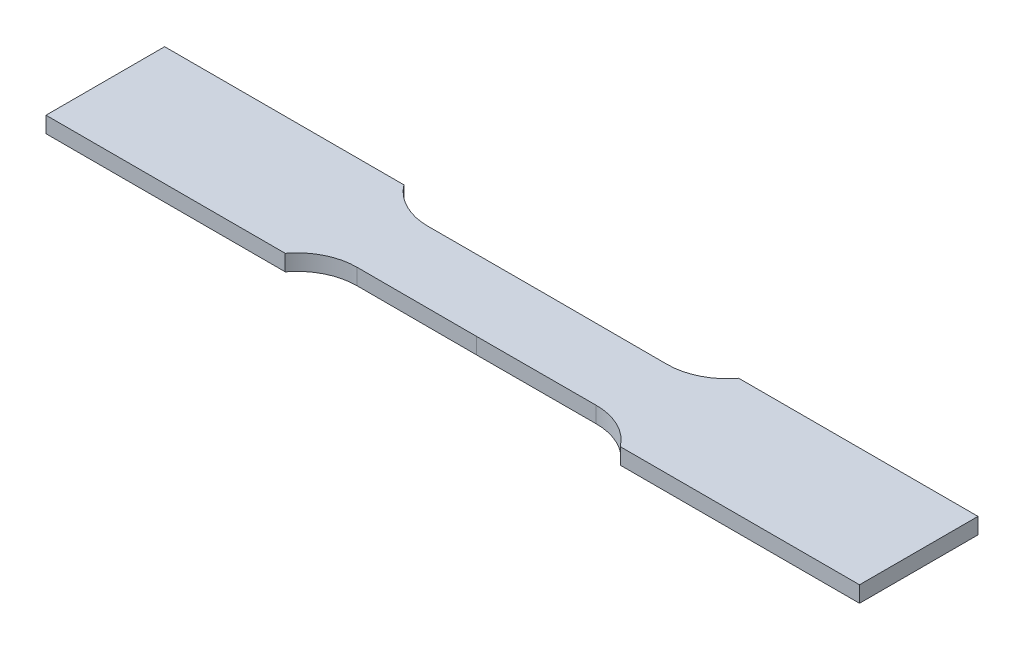
ISO-10303-21;
HEADER;
FILE_DESCRIPTION(('STEP AP214'),'2;1');
FILE_NAME('part.step','',(''),(''),'','','');
FILE_SCHEMA(('AUTOMOTIVE_DESIGN { 1 0 10303 214 1 1 1 1 }'));
ENDSEC;
DATA;
#1=APPLICATION_CONTEXT('core data for automotive mechanical design processes');
#2=APPLICATION_PROTOCOL_DEFINITION('international standard','automotive_design',2000,#1);
#3=PRODUCT_CONTEXT('',#1,'mechanical');
#4=PRODUCT('Part','Part','',(#3));
#5=PRODUCT_RELATED_PRODUCT_CATEGORY('part','',(#4));
#6=PRODUCT_DEFINITION_FORMATION('','',#4);
#7=PRODUCT_DEFINITION_CONTEXT('part definition',#1,'design');
#8=PRODUCT_DEFINITION('design','',#6,#7);
#9=PRODUCT_DEFINITION_SHAPE('','',#8);
#10=(LENGTH_UNIT() NAMED_UNIT(*) SI_UNIT(.MILLI.,.METRE.));
#11=(NAMED_UNIT(*) PLANE_ANGLE_UNIT() SI_UNIT($,.RADIAN.));
#12=(NAMED_UNIT(*) SI_UNIT($,.STERADIAN.) SOLID_ANGLE_UNIT());
#13=UNCERTAINTY_MEASURE_WITH_UNIT(LENGTH_MEASURE(1.E-05),#10,'distance_accuracy_value','');
#14=(GEOMETRIC_REPRESENTATION_CONTEXT(3) GLOBAL_UNCERTAINTY_ASSIGNED_CONTEXT((#13)) GLOBAL_UNIT_ASSIGNED_CONTEXT((#10,
#11,#12)) REPRESENTATION_CONTEXT('',''));
#15=CARTESIAN_POINT('',(0.,0.,0.));
#16=DIRECTION('',(0.,0.,1.));
#17=DIRECTION('',(1.,0.,0.));
#18=AXIS2_PLACEMENT_3D('',#15,#16,#17);
#19=CARTESIAN_POINT('',(0.,3.357,-12.381710976723));
#20=DIRECTION('',(0.,0.,-1.));
#21=DIRECTION('',(-1.,0.,0.));
#22=AXIS2_PLACEMENT_3D('',#19,#20,#21);
#23=PLANE('',#22);
#24=DIRECTION('',(1.,0.,0.));
#25=VECTOR('',#24,1.);
#26=CARTESIAN_POINT('',(0.,0.,-12.381710976723));
#27=LINE('',#26,#25);
#28=CARTESIAN_POINT('',(35.,0.,-12.3817109767229));
#29=VERTEX_POINT('',#28);
#30=CARTESIAN_POINT('',(85.,0.,-12.3817109767229));
#31=VERTEX_POINT('',#30);
#32=EDGE_CURVE('E168',#29,#31,#27,.T.);
#33=ORIENTED_EDGE('',*,*,#32,.F.);
#34=DIRECTION('',(0.,-1.,0.));
#35=VECTOR('',#34,1.);
#36=CARTESIAN_POINT('',(35.,3.357,-12.3817109767229));
#37=LINE('',#36,#35);
#38=CARTESIAN_POINT('',(35.,3.357,-12.3817109767229));
#39=VERTEX_POINT('',#38);
#40=EDGE_CURVE('E11',#39,#29,#37,.T.);
#41=ORIENTED_EDGE('',*,*,#40,.F.);
#42=DIRECTION('',(1.,0.,0.));
#43=VECTOR('',#42,1.);
#44=CARTESIAN_POINT('',(0.,3.357,-12.381710976723));
#45=LINE('',#44,#43);
#46=CARTESIAN_POINT('',(85.,3.357,-12.3817109767229));
#47=VERTEX_POINT('',#46);
#48=EDGE_CURVE('E201',#39,#47,#45,.T.);
#49=ORIENTED_EDGE('',*,*,#48,.T.);
#50=DIRECTION('',(0.,-1.,0.));
#51=VECTOR('',#50,1.);
#52=CARTESIAN_POINT('',(85.,3.357,-12.3817109767229));
#53=LINE('',#52,#51);
#54=EDGE_CURVE('E53',#47,#31,#53,.T.);
#55=ORIENTED_EDGE('',*,*,#54,.T.);
#56=EDGE_LOOP('',(#33,#41,#49,#55));
#57=FACE_BOUND('',#56,.T.);
#58=ADVANCED_FACE('F37',(#57),#23,.T.);
#59=CARTESIAN_POINT('',(25.01749998285,3.357,-19.904987750018));
#60=DIRECTION('',(0.,-1.,0.));
#61=DIRECTION('',(0.,0.,-1.));
#62=AXIS2_PLACEMENT_3D('',#59,#60,#61);
#63=CYLINDRICAL_SURFACE('',#62,12.5);
#64=CARTESIAN_POINT('',(25.01749998285,0.,-19.904987750018));
#65=DIRECTION('',(0.,1.,0.));
#66=DIRECTION('',(0.,0.,1.));
#67=AXIS2_PLACEMENT_3D('',#64,#65,#66);
#68=CIRCLE('',#67,12.5);
#69=CARTESIAN_POINT('',(25.,0.,-7.40500000000001));
#70=VERTEX_POINT('',#69);
#71=EDGE_CURVE('E170',#29,#70,#68,.F.);
#72=ORIENTED_EDGE('',*,*,#71,.T.);
#73=DIRECTION('',(0.,-1.,0.));
#74=VECTOR('',#73,1.);
#75=CARTESIAN_POINT('',(25.,3.357,-7.40500000000001));
#76=LINE('',#75,#74);
#77=CARTESIAN_POINT('',(25.,3.357,-7.40500000000001));
#78=VERTEX_POINT('',#77);
#79=EDGE_CURVE('E45',#78,#70,#76,.T.);
#80=ORIENTED_EDGE('',*,*,#79,.F.);
#81=CARTESIAN_POINT('',(25.01749998285,3.357,-19.904987750018));
#82=DIRECTION('',(0.,1.,0.));
#83=DIRECTION('',(0.,0.,1.));
#84=AXIS2_PLACEMENT_3D('',#81,#82,#83);
#85=CIRCLE('',#84,12.5);
#86=EDGE_CURVE('E250',#39,#78,#85,.F.);
#87=ORIENTED_EDGE('',*,*,#86,.F.);
#88=ORIENTED_EDGE('',*,*,#40,.T.);
#89=EDGE_LOOP('',(#72,#80,#87,#88));
#90=FACE_BOUND('',#89,.T.);
#91=ADVANCED_FACE('F283',(#90),#63,.F.);
#92=CARTESIAN_POINT('',(0.0104159795846786,3.357,-7.43998541762858));
#93=DIRECTION('',(-0.00139999862800182,0.,0.999999020001441));
#94=DIRECTION('',(0.999999020001441,0.,0.00139999862800182));
#95=AXIS2_PLACEMENT_3D('',#92,#93,#94);
#96=PLANE('',#95);
#97=DIRECTION('',(-0.999999020001441,0.,-0.00139999862800182));
#98=VECTOR('',#97,1.);
#99=CARTESIAN_POINT('',(0.0104159795846786,0.,-7.43998541762858));
#100=LINE('',#99,#98);
#101=CARTESIAN_POINT('',(0.,0.,-7.44));
#102=VERTEX_POINT('',#101);
#103=EDGE_CURVE('E172',#70,#102,#100,.T.);
#104=ORIENTED_EDGE('',*,*,#103,.T.);
#105=DIRECTION('',(0.,-1.,0.));
#106=VECTOR('',#105,1.);
#107=CARTESIAN_POINT('',(0.,3.357,-7.44));
#108=LINE('',#107,#106);
#109=CARTESIAN_POINT('',(0.,3.357,-7.44));
#110=VERTEX_POINT('',#109);
#111=EDGE_CURVE('E222',#110,#102,#108,.T.);
#112=ORIENTED_EDGE('',*,*,#111,.F.);
#113=DIRECTION('',(-0.999999020001441,0.,-0.00139999862800182));
#114=VECTOR('',#113,1.);
#115=CARTESIAN_POINT('',(0.0104159795846786,3.357,-7.43998541762858));
#116=LINE('',#115,#114);
#117=EDGE_CURVE('E231',#78,#110,#116,.T.);
#118=ORIENTED_EDGE('',*,*,#117,.F.);
#119=ORIENTED_EDGE('',*,*,#79,.T.);
#120=EDGE_LOOP('',(#104,#112,#118,#119));
#121=FACE_BOUND('',#120,.T.);
#122=ADVANCED_FACE('F229',(#121),#96,.F.);
#123=CARTESIAN_POINT('',(-0.00743999256000765,3.357,-7.43999256000744));
#124=DIRECTION('',(0.000999999500000403,0.,0.999999500000375));
#125=DIRECTION('',(0.999999500000375,0.,-0.000999999500000403));
#126=AXIS2_PLACEMENT_3D('',#123,#124,#125);
#127=PLANE('',#126);
#128=DIRECTION('',(-0.999999500000375,0.,0.000999999500000403));
#129=VECTOR('',#128,1.);
#130=CARTESIAN_POINT('',(-0.00743999256000765,0.,-7.43999256000744));
#131=LINE('',#130,#129);
#132=CARTESIAN_POINT('',(-25.,0.,-7.415));
#133=VERTEX_POINT('',#132);
#134=EDGE_CURVE('E174',#102,#133,#131,.T.);
#135=ORIENTED_EDGE('',*,*,#134,.T.);
#136=DIRECTION('',(0.,-1.,0.));
#137=VECTOR('',#136,1.);
#138=CARTESIAN_POINT('',(-25.,3.357,-7.415));
#139=LINE('',#138,#137);
#140=CARTESIAN_POINT('',(-25.,3.357,-7.415));
#141=VERTEX_POINT('',#140);
#142=EDGE_CURVE('E220',#141,#133,#139,.T.);
#143=ORIENTED_EDGE('',*,*,#142,.F.);
#144=DIRECTION('',(-0.999999500000375,0.,0.000999999500000403));
#145=VECTOR('',#144,1.);
#146=CARTESIAN_POINT('',(-0.00743999256000765,3.357,-7.43999256000744));
#147=LINE('',#146,#145);
#148=EDGE_CURVE('E244',#110,#141,#147,.T.);
#149=ORIENTED_EDGE('',*,*,#148,.F.);
#150=ORIENTED_EDGE('',*,*,#111,.T.);
#151=EDGE_LOOP('',(#135,#143,#149,#150));
#152=FACE_BOUND('',#151,.T.);
#153=ADVANCED_FACE('F241',(#152),#127,.F.);
#154=CARTESIAN_POINT('',(-25.01249999375,3.357,-19.9149937500047));
#155=DIRECTION('',(0.,-1.,0.));
#156=DIRECTION('',(0.,0.,-1.));
#157=AXIS2_PLACEMENT_3D('',#154,#155,#156);
#158=CYLINDRICAL_SURFACE('',#157,12.5);
#159=CARTESIAN_POINT('',(-25.01249999375,0.,-19.9149937500047));
#160=DIRECTION('',(0.,1.,0.));
#161=DIRECTION('',(0.,0.,1.));
#162=AXIS2_PLACEMENT_3D('',#159,#160,#161);
#163=CIRCLE('',#162,12.5);
#164=CARTESIAN_POINT('',(-35.,0.,-12.3983559627253));
#165=VERTEX_POINT('',#164);
#166=EDGE_CURVE('E177',#165,#133,#163,.T.);
#167=ORIENTED_EDGE('',*,*,#166,.F.);
#168=DIRECTION('',(0.,-1.,0.));
#169=VECTOR('',#168,1.);
#170=CARTESIAN_POINT('',(-35.,3.357,-12.3983559627253));
#171=LINE('',#170,#169);
#172=CARTESIAN_POINT('',(-35.,3.357,-12.3983559627253));
#173=VERTEX_POINT('',#172);
#174=EDGE_CURVE('E218',#173,#165,#171,.T.);
#175=ORIENTED_EDGE('',*,*,#174,.F.);
#176=CARTESIAN_POINT('',(-25.01249999375,3.357,-19.9149937500047));
#177=DIRECTION('',(0.,1.,0.));
#178=DIRECTION('',(0.,0.,1.));
#179=AXIS2_PLACEMENT_3D('',#176,#177,#178);
#180=CIRCLE('',#179,12.5);
#181=EDGE_CURVE('E246',#173,#141,#180,.T.);
#182=ORIENTED_EDGE('',*,*,#181,.T.);
#183=ORIENTED_EDGE('',*,*,#142,.T.);
#184=EDGE_LOOP('',(#167,#175,#182,#183));
#185=FACE_BOUND('',#184,.T.);
#186=ADVANCED_FACE('F294',(#185),#158,.F.);
#187=CARTESIAN_POINT('',(0.,3.357,-12.3983559627253));
#188=DIRECTION('',(0.,0.,1.));
#189=DIRECTION('',(1.,0.,0.));
#190=AXIS2_PLACEMENT_3D('',#187,#188,#189);
#191=PLANE('',#190);
#192=DIRECTION('',(-1.,0.,0.));
#193=VECTOR('',#192,1.);
#194=CARTESIAN_POINT('',(0.,0.,-12.3983559627253));
#195=LINE('',#194,#193);
#196=CARTESIAN_POINT('',(-85.,0.,-12.3983559627253));
#197=VERTEX_POINT('',#196);
#198=EDGE_CURVE('E180',#165,#197,#195,.T.);
#199=ORIENTED_EDGE('',*,*,#198,.T.);
#200=DIRECTION('',(0.,-1.,0.));
#201=VECTOR('',#200,1.);
#202=CARTESIAN_POINT('',(-85.,3.357,-12.3983559627253));
#203=LINE('',#202,#201);
#204=CARTESIAN_POINT('',(-85.,3.357,-12.3983559627253));
#205=VERTEX_POINT('',#204);
#206=EDGE_CURVE('E215',#205,#197,#203,.T.);
#207=ORIENTED_EDGE('',*,*,#206,.F.);
#208=DIRECTION('',(-1.,0.,0.));
#209=VECTOR('',#208,1.);
#210=CARTESIAN_POINT('',(0.,3.357,-12.3983559627253));
#211=LINE('',#210,#209);
#212=EDGE_CURVE('E248',#173,#205,#211,.T.);
#213=ORIENTED_EDGE('',*,*,#212,.F.);
#214=ORIENTED_EDGE('',*,*,#174,.T.);
#215=EDGE_LOOP('',(#199,#207,#213,#214));
#216=FACE_BOUND('',#215,.T.);
#217=ADVANCED_FACE('F297',(#216),#191,.F.);
#218=CARTESIAN_POINT('',(-85.,3.357,0.));
#219=DIRECTION('',(1.,0.,0.));
#220=DIRECTION('',(0.,0.,-1.));
#221=AXIS2_PLACEMENT_3D('',#218,#219,#220);
#222=PLANE('',#221);
#223=DIRECTION('',(0.,0.,1.));
#224=VECTOR('',#223,1.);
#225=CARTESIAN_POINT('',(-85.,0.,0.));
#226=LINE('',#225,#224);
#227=CARTESIAN_POINT('',(-85.,0.,12.3983559627253));
#228=VERTEX_POINT('',#227);
#229=EDGE_CURVE('E182',#197,#228,#226,.T.);
#230=ORIENTED_EDGE('',*,*,#229,.T.);
#231=DIRECTION('',(0.,-1.,0.));
#232=VECTOR('',#231,1.);
#233=CARTESIAN_POINT('',(-85.,3.357,12.3983559627253));
#234=LINE('',#233,#232);
#235=CARTESIAN_POINT('',(-85.,3.357,12.3983559627253));
#236=VERTEX_POINT('',#235);
#237=EDGE_CURVE('E213',#236,#228,#234,.T.);
#238=ORIENTED_EDGE('',*,*,#237,.F.);
#239=DIRECTION('',(0.,0.,1.));
#240=VECTOR('',#239,1.);
#241=CARTESIAN_POINT('',(-85.,3.357,0.));
#242=LINE('',#241,#240);
#243=EDGE_CURVE('E255',#205,#236,#242,.T.);
#244=ORIENTED_EDGE('',*,*,#243,.F.);
#245=ORIENTED_EDGE('',*,*,#206,.T.);
#246=EDGE_LOOP('',(#230,#238,#244,#245));
#247=FACE_BOUND('',#246,.T.);
#248=ADVANCED_FACE('F301',(#247),#222,.F.);
#249=CARTESIAN_POINT('',(0.,3.357,12.3983559627253));
#250=DIRECTION('',(0.,0.,1.));
#251=DIRECTION('',(1.,0.,0.));
#252=AXIS2_PLACEMENT_3D('',#249,#250,#251);
#253=PLANE('',#252);
#254=DIRECTION('',(-1.,0.,0.));
#255=VECTOR('',#254,1.);
#256=CARTESIAN_POINT('',(0.,0.,12.3983559627253));
#257=LINE('',#256,#255);
#258=CARTESIAN_POINT('',(-35.,0.,12.3983559627253));
#259=VERTEX_POINT('',#258);
#260=EDGE_CURVE('E185',#259,#228,#257,.T.);
#261=ORIENTED_EDGE('',*,*,#260,.F.);
#262=DIRECTION('',(0.,-1.,0.));
#263=VECTOR('',#262,1.);
#264=CARTESIAN_POINT('',(-35.,3.357,12.3983559627253));
#265=LINE('',#264,#263);
#266=CARTESIAN_POINT('',(-35.,3.357,12.3983559627253));
#267=VERTEX_POINT('',#266);
#268=EDGE_CURVE('E211',#267,#259,#265,.T.);
#269=ORIENTED_EDGE('',*,*,#268,.F.);
#270=DIRECTION('',(-1.,0.,0.));
#271=VECTOR('',#270,1.);
#272=CARTESIAN_POINT('',(0.,3.357,12.3983559627253));
#273=LINE('',#272,#271);
#274=EDGE_CURVE('E257',#267,#236,#273,.T.);
#275=ORIENTED_EDGE('',*,*,#274,.T.);
#276=ORIENTED_EDGE('',*,*,#237,.T.);
#277=EDGE_LOOP('',(#261,#269,#275,#276));
#278=FACE_BOUND('',#277,.T.);
#279=ADVANCED_FACE('F305',(#278),#253,.T.);
#280=CARTESIAN_POINT('',(-25.01249999375,3.357,19.9149937500047));
#281=DIRECTION('',(0.,-1.,0.));
#282=DIRECTION('',(0.,0.,-1.));
#283=AXIS2_PLACEMENT_3D('',#280,#281,#282);
#284=CYLINDRICAL_SURFACE('',#283,12.5);
#285=CARTESIAN_POINT('',(-25.01249999375,0.,19.9149937500047));
#286=DIRECTION('',(0.,1.,0.));
#287=DIRECTION('',(0.,0.,1.));
#288=AXIS2_PLACEMENT_3D('',#285,#286,#287);
#289=CIRCLE('',#288,12.5);
#290=CARTESIAN_POINT('',(-25.,0.,7.415));
#291=VERTEX_POINT('',#290);
#292=EDGE_CURVE('E188',#259,#291,#289,.F.);
#293=ORIENTED_EDGE('',*,*,#292,.T.);
#294=DIRECTION('',(0.,-1.,0.));
#295=VECTOR('',#294,1.);
#296=CARTESIAN_POINT('',(-25.,3.357,7.415));
#297=LINE('',#296,#295);
#298=CARTESIAN_POINT('',(-25.,3.357,7.415));
#299=VERTEX_POINT('',#298);
#300=EDGE_CURVE('E208',#299,#291,#297,.T.);
#301=ORIENTED_EDGE('',*,*,#300,.F.);
#302=CARTESIAN_POINT('',(-25.01249999375,3.357,19.9149937500047));
#303=DIRECTION('',(0.,1.,0.));
#304=DIRECTION('',(0.,0.,1.));
#305=AXIS2_PLACEMENT_3D('',#302,#303,#304);
#306=CIRCLE('',#305,12.5);
#307=EDGE_CURVE('E260',#267,#299,#306,.F.);
#308=ORIENTED_EDGE('',*,*,#307,.F.);
#309=ORIENTED_EDGE('',*,*,#268,.T.);
#310=EDGE_LOOP('',(#293,#301,#308,#309));
#311=FACE_BOUND('',#310,.T.);
#312=ADVANCED_FACE('F309',(#311),#284,.F.);
#313=CARTESIAN_POINT('',(-0.00743999256000765,3.357,7.43999256000744));
#314=DIRECTION('',(0.000999999500000403,0.,-0.999999500000375));
#315=DIRECTION('',(-0.999999500000375,0.,-0.000999999500000403));
#316=AXIS2_PLACEMENT_3D('',#313,#314,#315);
#317=PLANE('',#316);
#318=DIRECTION('',(0.999999500000375,0.,0.000999999500000403));
#319=VECTOR('',#318,1.);
#320=CARTESIAN_POINT('',(-0.00743999256000765,0.,7.43999256000744));
#321=LINE('',#320,#319);
#322=CARTESIAN_POINT('',(0.,0.,7.44));
#323=VERTEX_POINT('',#322);
#324=EDGE_CURVE('E190',#291,#323,#321,.T.);
#325=ORIENTED_EDGE('',*,*,#324,.T.);
#326=DIRECTION('',(0.,-1.,0.));
#327=VECTOR('',#326,1.);
#328=CARTESIAN_POINT('',(0.,3.357,7.44));
#329=LINE('',#328,#327);
#330=CARTESIAN_POINT('',(0.,3.357,7.44));
#331=VERTEX_POINT('',#330);
#332=EDGE_CURVE('E205',#331,#323,#329,.T.);
#333=ORIENTED_EDGE('',*,*,#332,.F.);
#334=DIRECTION('',(0.999999500000375,0.,0.000999999500000403));
#335=VECTOR('',#334,1.);
#336=CARTESIAN_POINT('',(-0.00743999256000765,3.357,7.43999256000744));
#337=LINE('',#336,#335);
#338=EDGE_CURVE('E163',#299,#331,#337,.T.);
#339=ORIENTED_EDGE('',*,*,#338,.F.);
#340=ORIENTED_EDGE('',*,*,#300,.T.);
#341=EDGE_LOOP('',(#325,#333,#339,#340));
#342=FACE_BOUND('',#341,.T.);
#343=ADVANCED_FACE('F267',(#342),#317,.F.);
#344=CARTESIAN_POINT('',(0.0104159795846817,3.357,7.43998541762858));
#345=DIRECTION('',(-0.00139999862800224,0.,-0.999999020001441));
#346=DIRECTION('',(-0.999999020001441,0.,0.00139999862800224));
#347=AXIS2_PLACEMENT_3D('',#344,#345,#346);
#348=PLANE('',#347);
#349=DIRECTION('',(0.999999020001441,0.,-0.00139999862800224));
#350=VECTOR('',#349,1.);
#351=CARTESIAN_POINT('',(0.0104159795846817,0.,7.43998541762858));
#352=LINE('',#351,#350);
#353=CARTESIAN_POINT('',(25.,0.,7.405));
#354=VERTEX_POINT('',#353);
#355=EDGE_CURVE('E192',#323,#354,#352,.T.);
#356=ORIENTED_EDGE('',*,*,#355,.T.);
#357=DIRECTION('',(0.,-1.,0.));
#358=VECTOR('',#357,1.);
#359=CARTESIAN_POINT('',(25.,3.357,7.405));
#360=LINE('',#359,#358);
#361=CARTESIAN_POINT('',(25.,3.357,7.405));
#362=VERTEX_POINT('',#361);
#363=EDGE_CURVE('E149',#362,#354,#360,.T.);
#364=ORIENTED_EDGE('',*,*,#363,.F.);
#365=DIRECTION('',(0.999999020001441,0.,-0.00139999862800224));
#366=VECTOR('',#365,1.);
#367=CARTESIAN_POINT('',(0.0104159795846817,3.357,7.43998541762858));
#368=LINE('',#367,#366);
#369=EDGE_CURVE('E160',#331,#362,#368,.T.);
#370=ORIENTED_EDGE('',*,*,#369,.F.);
#371=ORIENTED_EDGE('',*,*,#332,.T.);
#372=EDGE_LOOP('',(#356,#364,#370,#371));
#373=FACE_BOUND('',#372,.T.);
#374=ADVANCED_FACE('F271',(#373),#348,.F.);
#375=CARTESIAN_POINT('',(25.01749998285,3.357,19.904987750018));
#376=DIRECTION('',(0.,-1.,0.));
#377=DIRECTION('',(0.,0.,-1.));
#378=AXIS2_PLACEMENT_3D('',#375,#376,#377);
#379=CYLINDRICAL_SURFACE('',#378,12.5);
#380=CARTESIAN_POINT('',(25.01749998285,0.,19.904987750018));
#381=DIRECTION('',(0.,1.,0.));
#382=DIRECTION('',(0.,0.,1.));
#383=AXIS2_PLACEMENT_3D('',#380,#381,#382);
#384=CIRCLE('',#383,12.5);
#385=CARTESIAN_POINT('',(35.,0.,12.3817109767229));
#386=VERTEX_POINT('',#385);
#387=EDGE_CURVE('E146',#386,#354,#384,.T.);
#388=ORIENTED_EDGE('',*,*,#387,.F.);
#389=DIRECTION('',(0.,-1.,0.));
#390=VECTOR('',#389,1.);
#391=CARTESIAN_POINT('',(35.,3.357,12.3817109767229));
#392=LINE('',#391,#390);
#393=CARTESIAN_POINT('',(35.,3.357,12.3817109767229));
#394=VERTEX_POINT('',#393);
#395=EDGE_CURVE('E140',#394,#386,#392,.T.);
#396=ORIENTED_EDGE('',*,*,#395,.F.);
#397=CARTESIAN_POINT('',(25.01749998285,3.357,19.904987750018));
#398=DIRECTION('',(0.,1.,0.));
#399=DIRECTION('',(0.,0.,1.));
#400=AXIS2_PLACEMENT_3D('',#397,#398,#399);
#401=CIRCLE('',#400,12.5);
#402=EDGE_CURVE('E144',#394,#362,#401,.T.);
#403=ORIENTED_EDGE('',*,*,#402,.T.);
#404=ORIENTED_EDGE('',*,*,#363,.T.);
#405=EDGE_LOOP('',(#388,#396,#403,#404));
#406=FACE_BOUND('',#405,.T.);
#407=ADVANCED_FACE('F142',(#406),#379,.F.);
#408=CARTESIAN_POINT('',(0.,3.357,12.381710976723));
#409=DIRECTION('',(0.,0.,-1.));
#410=DIRECTION('',(-1.,0.,0.));
#411=AXIS2_PLACEMENT_3D('',#408,#409,#410);
#412=PLANE('',#411);
#413=DIRECTION('',(1.,0.,0.));
#414=VECTOR('',#413,1.);
#415=CARTESIAN_POINT('',(0.,0.,12.381710976723));
#416=LINE('',#415,#414);
#417=CARTESIAN_POINT('',(85.,0.,12.3817109767229));
#418=VERTEX_POINT('',#417);
#419=EDGE_CURVE('E196',#386,#418,#416,.T.);
#420=ORIENTED_EDGE('',*,*,#419,.T.);
#421=DIRECTION('',(0.,-1.,0.));
#422=VECTOR('',#421,1.);
#423=CARTESIAN_POINT('',(85.,3.357,12.3817109767229));
#424=LINE('',#423,#422);
#425=CARTESIAN_POINT('',(85.,3.357,12.3817109767229));
#426=VERTEX_POINT('',#425);
#427=EDGE_CURVE('E97',#426,#418,#424,.T.);
#428=ORIENTED_EDGE('',*,*,#427,.F.);
#429=DIRECTION('',(1.,0.,0.));
#430=VECTOR('',#429,1.);
#431=CARTESIAN_POINT('',(0.,3.357,12.381710976723));
#432=LINE('',#431,#430);
#433=EDGE_CURVE('E151',#394,#426,#432,.T.);
#434=ORIENTED_EDGE('',*,*,#433,.F.);
#435=ORIENTED_EDGE('',*,*,#395,.T.);
#436=EDGE_LOOP('',(#420,#428,#434,#435));
#437=FACE_BOUND('',#436,.T.);
#438=ADVANCED_FACE('F152',(#437),#412,.F.);
#439=CARTESIAN_POINT('',(85.,3.357,0.));
#440=DIRECTION('',(1.,0.,0.));
#441=DIRECTION('',(0.,0.,-1.));
#442=AXIS2_PLACEMENT_3D('',#439,#440,#441);
#443=PLANE('',#442);
#444=DIRECTION('',(0.,0.,1.));
#445=VECTOR('',#444,1.);
#446=CARTESIAN_POINT('',(85.,0.,0.));
#447=LINE('',#446,#445);
#448=EDGE_CURVE('E198',#31,#418,#447,.T.);
#449=ORIENTED_EDGE('',*,*,#448,.F.);
#450=ORIENTED_EDGE('',*,*,#54,.F.);
#451=DIRECTION('',(0.,0.,1.));
#452=VECTOR('',#451,1.);
#453=CARTESIAN_POINT('',(85.,3.357,0.));
#454=LINE('',#453,#452);
#455=EDGE_CURVE('E155',#47,#426,#454,.T.);
#456=ORIENTED_EDGE('',*,*,#455,.T.);
#457=ORIENTED_EDGE('',*,*,#427,.T.);
#458=EDGE_LOOP('',(#449,#450,#456,#457));
#459=FACE_BOUND('',#458,.T.);
#460=ADVANCED_FACE('F272',(#459),#443,.T.);
#461=CARTESIAN_POINT('',(0.,3.357,0.));
#462=DIRECTION('',(0.,1.,0.));
#463=DIRECTION('',(0.,0.,1.));
#464=AXIS2_PLACEMENT_3D('',#461,#462,#463);
#465=PLANE('',#464);
#466=ORIENTED_EDGE('',*,*,#48,.F.);
#467=ORIENTED_EDGE('',*,*,#86,.T.);
#468=ORIENTED_EDGE('',*,*,#117,.T.);
#469=ORIENTED_EDGE('',*,*,#148,.T.);
#470=ORIENTED_EDGE('',*,*,#181,.F.);
#471=ORIENTED_EDGE('',*,*,#212,.T.);
#472=ORIENTED_EDGE('',*,*,#243,.T.);
#473=ORIENTED_EDGE('',*,*,#274,.F.);
#474=ORIENTED_EDGE('',*,*,#307,.T.);
#475=ORIENTED_EDGE('',*,*,#338,.T.);
#476=ORIENTED_EDGE('',*,*,#369,.T.);
#477=ORIENTED_EDGE('',*,*,#402,.F.);
#478=ORIENTED_EDGE('',*,*,#433,.T.);
#479=ORIENTED_EDGE('',*,*,#455,.F.);
#480=EDGE_LOOP('',(#466,#467,#468,#469,#470,#471,#472,#473,#474,#475,#476,#477,#478,#479));
#481=FACE_BOUND('',#480,.T.);
#482=ADVANCED_FACE('F158',(#481),#465,.T.);
#483=CARTESIAN_POINT('',(0.,0.,0.));
#484=DIRECTION('',(0.,1.,0.));
#485=DIRECTION('',(0.,0.,1.));
#486=AXIS2_PLACEMENT_3D('',#483,#484,#485);
#487=PLANE('',#486);
#488=ORIENTED_EDGE('',*,*,#32,.T.);
#489=ORIENTED_EDGE('',*,*,#448,.T.);
#490=ORIENTED_EDGE('',*,*,#419,.F.);
#491=ORIENTED_EDGE('',*,*,#387,.T.);
#492=ORIENTED_EDGE('',*,*,#355,.F.);
#493=ORIENTED_EDGE('',*,*,#324,.F.);
#494=ORIENTED_EDGE('',*,*,#292,.F.);
#495=ORIENTED_EDGE('',*,*,#260,.T.);
#496=ORIENTED_EDGE('',*,*,#229,.F.);
#497=ORIENTED_EDGE('',*,*,#198,.F.);
#498=ORIENTED_EDGE('',*,*,#166,.T.);
#499=ORIENTED_EDGE('',*,*,#134,.F.);
#500=ORIENTED_EDGE('',*,*,#103,.F.);
#501=ORIENTED_EDGE('',*,*,#71,.F.);
#502=EDGE_LOOP('',(#488,#489,#490,#491,#492,#493,#494,#495,#496,#497,#498,#499,#500,#501));
#503=FACE_BOUND('',#502,.T.);
#504=ADVANCED_FACE('F236',(#503),#487,.F.);
#505=CLOSED_SHELL('',(#58,#91,#122,#153,#186,#217,#248,#279,#312,#343,#374,#407,#438,#460,#482,#504));
#506=MANIFOLD_SOLID_BREP('B2',#505);
#507=ADVANCED_BREP_SHAPE_REPRESENTATION('',(#18,#506),#14);
#508=SHAPE_DEFINITION_REPRESENTATION(#9,#507);
ENDSEC;
END-ISO-10303-21;
